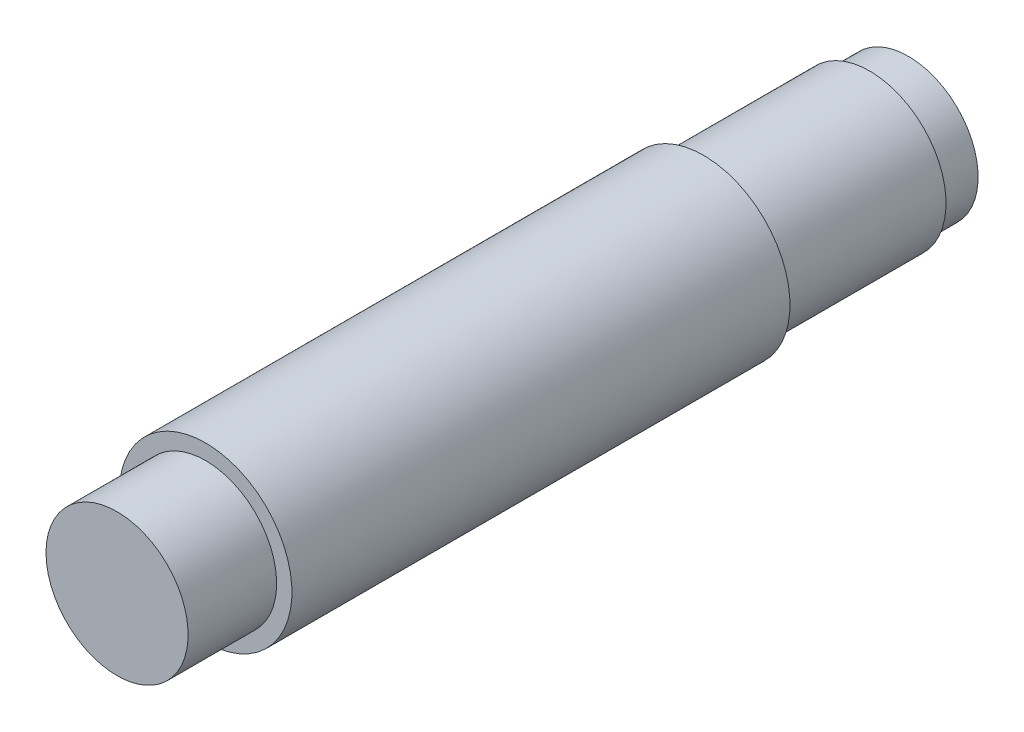
ISO-10303-21;
HEADER;
FILE_DESCRIPTION(('STEP AP214'),'2;1');
FILE_NAME('part.step','',(''),(''),'','','');
FILE_SCHEMA(('AUTOMOTIVE_DESIGN { 1 0 10303 214 1 1 1 1 }'));
ENDSEC;
DATA;
#1=APPLICATION_CONTEXT('core data for automotive mechanical design processes');
#2=APPLICATION_PROTOCOL_DEFINITION('international standard','automotive_design',2000,#1);
#3=PRODUCT_CONTEXT('',#1,'mechanical');
#4=PRODUCT('Part','Part','',(#3));
#5=PRODUCT_RELATED_PRODUCT_CATEGORY('part','',(#4));
#6=PRODUCT_DEFINITION_FORMATION('','',#4);
#7=PRODUCT_DEFINITION_CONTEXT('part definition',#1,'design');
#8=PRODUCT_DEFINITION('design','',#6,#7);
#9=PRODUCT_DEFINITION_SHAPE('','',#8);
#10=(LENGTH_UNIT() NAMED_UNIT(*) SI_UNIT(.MILLI.,.METRE.));
#11=(NAMED_UNIT(*) PLANE_ANGLE_UNIT() SI_UNIT($,.RADIAN.));
#12=(NAMED_UNIT(*) SI_UNIT($,.STERADIAN.) SOLID_ANGLE_UNIT());
#13=UNCERTAINTY_MEASURE_WITH_UNIT(LENGTH_MEASURE(1.E-05),#10,'distance_accuracy_value','');
#14=(GEOMETRIC_REPRESENTATION_CONTEXT(3) GLOBAL_UNCERTAINTY_ASSIGNED_CONTEXT((#13)) GLOBAL_UNIT_ASSIGNED_CONTEXT((#10,
#11,#12)) REPRESENTATION_CONTEXT('',''));
#15=CARTESIAN_POINT('',(0.,0.,0.));
#16=DIRECTION('',(0.,0.,1.));
#17=DIRECTION('',(1.,0.,0.));
#18=AXIS2_PLACEMENT_3D('',#15,#16,#17);
#19=CARTESIAN_POINT('',(3.15,0.,-11.1837989785303));
#20=DIRECTION('',(0.,0.,1.));
#21=DIRECTION('',(1.,0.,0.));
#22=AXIS2_PLACEMENT_3D('',#19,#20,#21);
#23=PLANE('',#22);
#24=CARTESIAN_POINT('',(0.,0.,-11.1837989785303));
#25=DIRECTION('',(0.,0.,-1.));
#26=DIRECTION('',(-1.,0.,0.));
#27=AXIS2_PLACEMENT_3D('',#24,#25,#26);
#28=CIRCLE('',#27,3.15);
#29=CARTESIAN_POINT('',(-3.15,0.,-11.1837989785303));
#30=VERTEX_POINT('',#29);
#31=EDGE_CURVE('E61',#30,#30,#28,.T.);
#32=ORIENTED_EDGE('',*,*,#31,.T.);
#33=EDGE_LOOP('',(#32));
#34=FACE_BOUND('',#33,.T.);
#35=ADVANCED_FACE('F33',(#34),#23,.F.);
#36=CARTESIAN_POINT('',(0.,0.,24.5662010214697));
#37=DIRECTION('',(0.,0.,-1.));
#38=DIRECTION('',(-1.,0.,0.));
#39=AXIS2_PLACEMENT_3D('',#36,#37,#38);
#40=PLANE('',#39);
#41=CARTESIAN_POINT('',(0.,0.,24.5662010214697));
#42=DIRECTION('',(0.,0.,-1.));
#43=DIRECTION('',(-1.,0.,0.));
#44=AXIS2_PLACEMENT_3D('',#41,#42,#43);
#45=CIRCLE('',#44,3.21);
#46=CARTESIAN_POINT('',(-3.21,0.,24.5662010214697));
#47=VERTEX_POINT('',#46);
#48=EDGE_CURVE('E10',#47,#47,#45,.T.);
#49=ORIENTED_EDGE('',*,*,#48,.F.);
#50=EDGE_LOOP('',(#49));
#51=FACE_BOUND('',#50,.T.);
#52=ADVANCED_FACE('F103',(#51),#40,.F.);
#53=CARTESIAN_POINT('',(0.,0.,-14.0190235453798));
#54=DIRECTION('',(0.,0.,-1.));
#55=DIRECTION('',(-1.,0.,0.));
#56=AXIS2_PLACEMENT_3D('',#53,#54,#55);
#57=CYLINDRICAL_SURFACE('',#56,3.21);
#58=CARTESIAN_POINT('',(0.,0.,20.5662010214697));
#59=DIRECTION('',(0.,0.,-1.));
#60=DIRECTION('',(-1.,0.,0.));
#61=AXIS2_PLACEMENT_3D('',#58,#59,#60);
#62=CIRCLE('',#61,3.21);
#63=CARTESIAN_POINT('',(-3.21,0.,20.5662010214697));
#64=VERTEX_POINT('',#63);
#65=EDGE_CURVE('E39',#64,#64,#62,.T.);
#66=ORIENTED_EDGE('',*,*,#65,.F.);
#67=EDGE_LOOP('',(#66));
#68=FACE_BOUND('',#67,.T.);
#69=ORIENTED_EDGE('',*,*,#48,.T.);
#70=EDGE_LOOP('',(#69));
#71=FACE_BOUND('',#70,.T.);
#72=ADVANCED_FACE('F98',(#68,#71),#57,.T.);
#73=CARTESIAN_POINT('',(3.21,0.,20.5662010214697));
#74=DIRECTION('',(0.,0.,-1.));
#75=DIRECTION('',(-1.,0.,0.));
#76=AXIS2_PLACEMENT_3D('',#73,#74,#75);
#77=PLANE('',#76);
#78=CARTESIAN_POINT('',(0.,0.,20.5662010214697));
#79=DIRECTION('',(0.,0.,-1.));
#80=DIRECTION('',(-1.,0.,0.));
#81=AXIS2_PLACEMENT_3D('',#78,#79,#80);
#82=CIRCLE('',#81,3.9);
#83=CARTESIAN_POINT('',(-3.9,0.,20.5662010214697));
#84=VERTEX_POINT('',#83);
#85=EDGE_CURVE('E43',#84,#84,#82,.T.);
#86=ORIENTED_EDGE('',*,*,#85,.F.);
#87=EDGE_LOOP('',(#86));
#88=FACE_BOUND('',#87,.T.);
#89=ORIENTED_EDGE('',*,*,#65,.T.);
#90=EDGE_LOOP('',(#89));
#91=FACE_BOUND('',#90,.T.);
#92=ADVANCED_FACE('F93',(#88,#91),#77,.F.);
#93=CARTESIAN_POINT('',(0.,0.,-14.0190235453798));
#94=DIRECTION('',(0.,0.,-1.));
#95=DIRECTION('',(-1.,0.,0.));
#96=AXIS2_PLACEMENT_3D('',#93,#94,#95);
#97=CYLINDRICAL_SURFACE('',#96,3.9);
#98=CARTESIAN_POINT('',(0.,0.,-1.93379897853026));
#99=DIRECTION('',(0.,0.,-1.));
#100=DIRECTION('',(-1.,0.,0.));
#101=AXIS2_PLACEMENT_3D('',#98,#99,#100);
#102=CIRCLE('',#101,3.9);
#103=CARTESIAN_POINT('',(-3.9,0.,-1.93379897853026));
#104=VERTEX_POINT('',#103);
#105=EDGE_CURVE('E47',#104,#104,#102,.T.);
#106=ORIENTED_EDGE('',*,*,#105,.F.);
#107=EDGE_LOOP('',(#106));
#108=FACE_BOUND('',#107,.T.);
#109=ORIENTED_EDGE('',*,*,#85,.T.);
#110=EDGE_LOOP('',(#109));
#111=FACE_BOUND('',#110,.T.);
#112=ADVANCED_FACE('F87',(#108,#111),#97,.T.);
#113=CARTESIAN_POINT('',(3.9,0.,-1.93379897853026));
#114=DIRECTION('',(0.,0.,1.));
#115=DIRECTION('',(1.,0.,0.));
#116=AXIS2_PLACEMENT_3D('',#113,#114,#115);
#117=PLANE('',#116);
#118=CARTESIAN_POINT('',(0.,0.,-1.93379897853026));
#119=DIRECTION('',(0.,0.,-1.));
#120=DIRECTION('',(-1.,0.,0.));
#121=AXIS2_PLACEMENT_3D('',#118,#119,#120);
#122=CIRCLE('',#121,3.45);
#123=CARTESIAN_POINT('',(-3.45,0.,-1.93379897853026));
#124=VERTEX_POINT('',#123);
#125=EDGE_CURVE('E52',#124,#124,#122,.T.);
#126=ORIENTED_EDGE('',*,*,#125,.F.);
#127=EDGE_LOOP('',(#126));
#128=FACE_BOUND('',#127,.T.);
#129=ORIENTED_EDGE('',*,*,#105,.T.);
#130=EDGE_LOOP('',(#129));
#131=FACE_BOUND('',#130,.T.);
#132=ADVANCED_FACE('F81',(#128,#131),#117,.F.);
#133=CARTESIAN_POINT('',(0.,0.,-14.0190235453798));
#134=DIRECTION('',(0.,0.,-1.));
#135=DIRECTION('',(-1.,0.,0.));
#136=AXIS2_PLACEMENT_3D('',#133,#134,#135);
#137=CYLINDRICAL_SURFACE('',#136,3.45);
#138=CARTESIAN_POINT('',(0.,0.,-9.43379897853026));
#139=DIRECTION('',(0.,0.,-1.));
#140=DIRECTION('',(-1.,0.,0.));
#141=AXIS2_PLACEMENT_3D('',#138,#139,#140);
#142=CIRCLE('',#141,3.45);
#143=CARTESIAN_POINT('',(-3.45,0.,-9.43379897853026));
#144=VERTEX_POINT('',#143);
#145=EDGE_CURVE('E55',#144,#144,#142,.T.);
#146=ORIENTED_EDGE('',*,*,#145,.F.);
#147=EDGE_LOOP('',(#146));
#148=FACE_BOUND('',#147,.T.);
#149=ORIENTED_EDGE('',*,*,#125,.T.);
#150=EDGE_LOOP('',(#149));
#151=FACE_BOUND('',#150,.T.);
#152=ADVANCED_FACE('F75',(#148,#151),#137,.T.);
#153=CARTESIAN_POINT('',(3.45,0.,-9.43379897853026));
#154=DIRECTION('',(0.,0.,1.));
#155=DIRECTION('',(1.,0.,0.));
#156=AXIS2_PLACEMENT_3D('',#153,#154,#155);
#157=PLANE('',#156);
#158=CARTESIAN_POINT('',(0.,0.,-9.43379897853026));
#159=DIRECTION('',(0.,0.,-1.));
#160=DIRECTION('',(-1.,0.,0.));
#161=AXIS2_PLACEMENT_3D('',#158,#159,#160);
#162=CIRCLE('',#161,3.15);
#163=CARTESIAN_POINT('',(-3.15,0.,-9.43379897853026));
#164=VERTEX_POINT('',#163);
#165=EDGE_CURVE('E58',#164,#164,#162,.T.);
#166=ORIENTED_EDGE('',*,*,#165,.F.);
#167=EDGE_LOOP('',(#166));
#168=FACE_BOUND('',#167,.T.);
#169=ORIENTED_EDGE('',*,*,#145,.T.);
#170=EDGE_LOOP('',(#169));
#171=FACE_BOUND('',#170,.T.);
#172=ADVANCED_FACE('F69',(#168,#171),#157,.F.);
#173=CARTESIAN_POINT('',(0.,0.,-14.0190235453798));
#174=DIRECTION('',(0.,0.,-1.));
#175=DIRECTION('',(-1.,0.,0.));
#176=AXIS2_PLACEMENT_3D('',#173,#174,#175);
#177=CYLINDRICAL_SURFACE('',#176,3.15);
#178=ORIENTED_EDGE('',*,*,#31,.F.);
#179=EDGE_LOOP('',(#178));
#180=FACE_BOUND('',#179,.T.);
#181=ORIENTED_EDGE('',*,*,#165,.T.);
#182=EDGE_LOOP('',(#181));
#183=FACE_BOUND('',#182,.T.);
#184=ADVANCED_FACE('F66',(#180,#183),#177,.T.);
#185=CLOSED_SHELL('',(#35,#52,#72,#92,#112,#132,#152,#172,#184));
#186=MANIFOLD_SOLID_BREP('B2',#185);
#187=ADVANCED_BREP_SHAPE_REPRESENTATION('',(#18,#186),#14);
#188=SHAPE_DEFINITION_REPRESENTATION(#9,#187);
ENDSEC;
END-ISO-10303-21;
